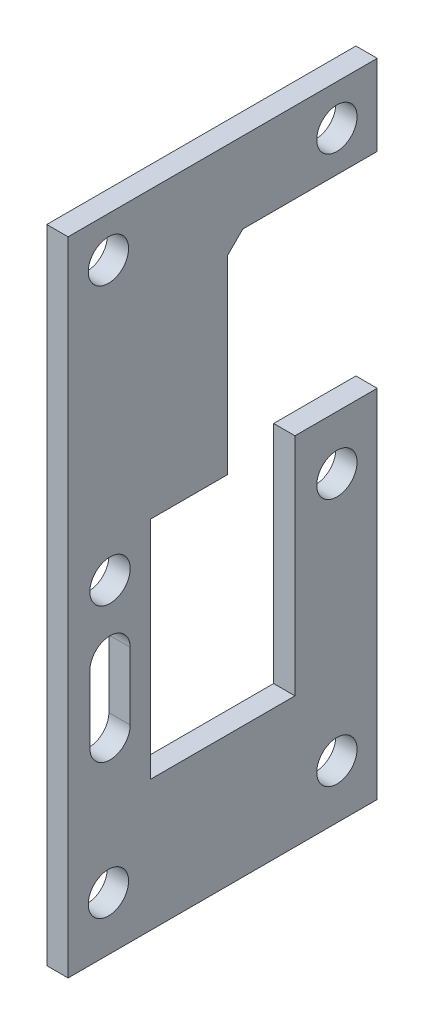
ISO-10303-21;
HEADER;
FILE_DESCRIPTION(('STEP AP214'),'2;1');
FILE_NAME('part.step','',(''),(''),'','','');
FILE_SCHEMA(('AUTOMOTIVE_DESIGN { 1 0 10303 214 1 1 1 1 }'));
ENDSEC;
DATA;
#1=APPLICATION_CONTEXT('core data for automotive mechanical design processes');
#2=APPLICATION_PROTOCOL_DEFINITION('international standard','automotive_design',2000,#1);
#3=PRODUCT_CONTEXT('',#1,'mechanical');
#4=PRODUCT('Part','Part','',(#3));
#5=PRODUCT_RELATED_PRODUCT_CATEGORY('part','',(#4));
#6=PRODUCT_DEFINITION_FORMATION('','',#4);
#7=PRODUCT_DEFINITION_CONTEXT('part definition',#1,'design');
#8=PRODUCT_DEFINITION('design','',#6,#7);
#9=PRODUCT_DEFINITION_SHAPE('','',#8);
#10=(LENGTH_UNIT() NAMED_UNIT(*) SI_UNIT(.MILLI.,.METRE.));
#11=(NAMED_UNIT(*) PLANE_ANGLE_UNIT() SI_UNIT($,.RADIAN.));
#12=(NAMED_UNIT(*) SI_UNIT($,.STERADIAN.) SOLID_ANGLE_UNIT());
#13=UNCERTAINTY_MEASURE_WITH_UNIT(LENGTH_MEASURE(1.E-05),#10,'distance_accuracy_value','');
#14=(GEOMETRIC_REPRESENTATION_CONTEXT(3) GLOBAL_UNCERTAINTY_ASSIGNED_CONTEXT((#13)) GLOBAL_UNIT_ASSIGNED_CONTEXT((#10,
#11,#12)) REPRESENTATION_CONTEXT('',''));
#15=CARTESIAN_POINT('',(0.,0.,0.));
#16=DIRECTION('',(0.,0.,1.));
#17=DIRECTION('',(1.,0.,0.));
#18=AXIS2_PLACEMENT_3D('',#15,#16,#17);
#19=CARTESIAN_POINT('',(3.175,47.76,-23.));
#20=DIRECTION('',(0.,0.,1.));
#21=DIRECTION('',(0.,-1.,0.));
#22=AXIS2_PLACEMENT_3D('',#19,#20,#21);
#23=PLANE('',#22);
#24=DIRECTION('',(0.,1.,0.));
#25=VECTOR('',#24,1.);
#26=CARTESIAN_POINT('',(3.175,47.76,-23.));
#27=LINE('',#26,#25);
#28=CARTESIAN_POINT('',(3.175,35.76,-23.));
#29=VERTEX_POINT('',#28);
#30=CARTESIAN_POINT('',(3.175,47.76,-23.));
#31=VERTEX_POINT('',#30);
#32=EDGE_CURVE('E296',#29,#31,#27,.T.);
#33=ORIENTED_EDGE('',*,*,#32,.F.);
#34=DIRECTION('',(1.,0.,0.));
#35=VECTOR('',#34,1.);
#36=CARTESIAN_POINT('',(0.,35.76,-23.));
#37=LINE('',#36,#35);
#38=CARTESIAN_POINT('',(0.,35.76,-23.));
#39=VERTEX_POINT('',#38);
#40=EDGE_CURVE('E286',#39,#29,#37,.T.);
#41=ORIENTED_EDGE('',*,*,#40,.F.);
#42=DIRECTION('',(0.,1.,0.));
#43=VECTOR('',#42,1.);
#44=CARTESIAN_POINT('',(0.,47.76,-23.));
#45=LINE('',#44,#43);
#46=CARTESIAN_POINT('',(0.,47.76,-23.));
#47=VERTEX_POINT('',#46);
#48=EDGE_CURVE('E307',#39,#47,#45,.T.);
#49=ORIENTED_EDGE('',*,*,#48,.T.);
#50=DIRECTION('',(-1.,0.,0.));
#51=VECTOR('',#50,1.);
#52=CARTESIAN_POINT('',(3.175,47.76,-23.));
#53=LINE('',#52,#51);
#54=EDGE_CURVE('E314',#31,#47,#53,.T.);
#55=ORIENTED_EDGE('',*,*,#54,.F.);
#56=EDGE_LOOP('',(#33,#41,#49,#55));
#57=FACE_BOUND('',#56,.T.);
#58=ADVANCED_FACE('F35',(#57),#23,.F.);
#59=CARTESIAN_POINT('',(3.175,47.76,23.));
#60=DIRECTION('',(0.,0.,-1.));
#61=DIRECTION('',(0.,1.,0.));
#62=AXIS2_PLACEMENT_3D('',#59,#60,#61);
#63=PLANE('',#62);
#64=DIRECTION('',(0.,-1.,0.));
#65=VECTOR('',#64,1.);
#66=CARTESIAN_POINT('',(0.,47.76,23.));
#67=LINE('',#66,#65);
#68=CARTESIAN_POINT('',(0.,47.76,23.));
#69=VERTEX_POINT('',#68);
#70=CARTESIAN_POINT('',(0.,-47.76,23.));
#71=VERTEX_POINT('',#70);
#72=EDGE_CURVE('E285',#69,#71,#67,.T.);
#73=ORIENTED_EDGE('',*,*,#72,.T.);
#74=DIRECTION('',(-1.,0.,0.));
#75=VECTOR('',#74,1.);
#76=CARTESIAN_POINT('',(3.175,-47.76,23.));
#77=LINE('',#76,#75);
#78=CARTESIAN_POINT('',(3.175,-47.76,23.));
#79=VERTEX_POINT('',#78);
#80=EDGE_CURVE('E11',#79,#71,#77,.T.);
#81=ORIENTED_EDGE('',*,*,#80,.F.);
#82=DIRECTION('',(0.,-1.,0.));
#83=VECTOR('',#82,1.);
#84=CARTESIAN_POINT('',(3.175,47.76,23.));
#85=LINE('',#84,#83);
#86=CARTESIAN_POINT('',(3.175,47.76,23.));
#87=VERTEX_POINT('',#86);
#88=EDGE_CURVE('E290',#87,#79,#85,.T.);
#89=ORIENTED_EDGE('',*,*,#88,.F.);
#90=DIRECTION('',(-1.,0.,0.));
#91=VECTOR('',#90,1.);
#92=CARTESIAN_POINT('',(3.175,47.76,23.));
#93=LINE('',#92,#91);
#94=EDGE_CURVE('E302',#87,#69,#93,.T.);
#95=ORIENTED_EDGE('',*,*,#94,.T.);
#96=EDGE_LOOP('',(#73,#81,#89,#95));
#97=FACE_BOUND('',#96,.T.);
#98=ADVANCED_FACE('F37',(#97),#63,.F.);
#99=CARTESIAN_POINT('',(3.175,-47.76,-23.));
#100=DIRECTION('',(0.,1.,0.));
#101=DIRECTION('',(0.,0.,1.));
#102=AXIS2_PLACEMENT_3D('',#99,#100,#101);
#103=PLANE('',#102);
#104=DIRECTION('',(0.,0.,-1.));
#105=VECTOR('',#104,1.);
#106=CARTESIAN_POINT('',(0.,-47.76,-23.));
#107=LINE('',#106,#105);
#108=CARTESIAN_POINT('',(0.,-47.76,-23.));
#109=VERTEX_POINT('',#108);
#110=EDGE_CURVE('E305',#71,#109,#107,.T.);
#111=ORIENTED_EDGE('',*,*,#110,.T.);
#112=DIRECTION('',(-1.,0.,0.));
#113=VECTOR('',#112,1.);
#114=CARTESIAN_POINT('',(3.175,-47.76,-23.));
#115=LINE('',#114,#113);
#116=CARTESIAN_POINT('',(3.175,-47.76,-23.));
#117=VERTEX_POINT('',#116);
#118=EDGE_CURVE('E43',#117,#109,#115,.T.);
#119=ORIENTED_EDGE('',*,*,#118,.F.);
#120=DIRECTION('',(0.,0.,-1.));
#121=VECTOR('',#120,1.);
#122=CARTESIAN_POINT('',(3.175,-47.76,-23.));
#123=LINE('',#122,#121);
#124=EDGE_CURVE('E293',#79,#117,#123,.T.);
#125=ORIENTED_EDGE('',*,*,#124,.F.);
#126=ORIENTED_EDGE('',*,*,#80,.T.);
#127=EDGE_LOOP('',(#111,#119,#125,#126));
#128=FACE_BOUND('',#127,.T.);
#129=ADVANCED_FACE('F335',(#128),#103,.F.);
#130=CARTESIAN_POINT('',(0.,5.24000000000001,-23.));
#131=VERTEX_POINT('',#130);
#132=EDGE_CURVE('E308',#109,#131,#45,.T.);
#133=ORIENTED_EDGE('',*,*,#132,.T.);
#134=DIRECTION('',(1.,0.,0.));
#135=VECTOR('',#134,1.);
#136=CARTESIAN_POINT('',(0.,5.23999999999999,-23.));
#137=LINE('',#136,#135);
#138=CARTESIAN_POINT('',(3.175,5.23999999999999,-23.));
#139=VERTEX_POINT('',#138);
#140=EDGE_CURVE('E279',#131,#139,#137,.T.);
#141=ORIENTED_EDGE('',*,*,#140,.T.);
#142=EDGE_CURVE('E297',#117,#139,#27,.T.);
#143=ORIENTED_EDGE('',*,*,#142,.F.);
#144=ORIENTED_EDGE('',*,*,#118,.T.);
#145=EDGE_LOOP('',(#133,#141,#143,#144));
#146=FACE_BOUND('',#145,.T.);
#147=ADVANCED_FACE('F321',(#146),#23,.F.);
#148=CARTESIAN_POINT('',(3.175,47.76,-23.));
#149=DIRECTION('',(0.,-1.,0.));
#150=DIRECTION('',(0.,0.,-1.));
#151=AXIS2_PLACEMENT_3D('',#148,#149,#150);
#152=PLANE('',#151);
#153=DIRECTION('',(0.,0.,1.));
#154=VECTOR('',#153,1.);
#155=CARTESIAN_POINT('',(0.,47.76,-23.));
#156=LINE('',#155,#154);
#157=EDGE_CURVE('E294',#47,#69,#156,.T.);
#158=ORIENTED_EDGE('',*,*,#157,.T.);
#159=ORIENTED_EDGE('',*,*,#94,.F.);
#160=DIRECTION('',(0.,0.,1.));
#161=VECTOR('',#160,1.);
#162=CARTESIAN_POINT('',(3.175,47.76,-23.));
#163=LINE('',#162,#161);
#164=EDGE_CURVE('E300',#31,#87,#163,.T.);
#165=ORIENTED_EDGE('',*,*,#164,.F.);
#166=ORIENTED_EDGE('',*,*,#54,.T.);
#167=EDGE_LOOP('',(#158,#159,#165,#166));
#168=FACE_BOUND('',#167,.T.);
#169=ADVANCED_FACE('F341',(#168),#152,.F.);
#170=CARTESIAN_POINT('',(3.175,0.,0.));
#171=DIRECTION('',(-1.,0.,0.));
#172=DIRECTION('',(0.,0.,1.));
#173=AXIS2_PLACEMENT_3D('',#170,#171,#172);
#174=PLANE('',#173);
#175=CARTESIAN_POINT('',(3.175,0.389999999999988,16.76));
#176=DIRECTION('',(1.,0.,0.));
#177=DIRECTION('',(0.,0.,-1.));
#178=AXIS2_PLACEMENT_3D('',#175,#176,#177);
#179=CIRCLE('',#178,3.);
#180=CARTESIAN_POINT('',(3.175,0.389999999999988,13.76));
#181=VERTEX_POINT('',#180);
#182=EDGE_CURVE('E178',#181,#181,#179,.T.);
#183=ORIENTED_EDGE('',*,*,#182,.F.);
#184=EDGE_LOOP('',(#183));
#185=FACE_BOUND('',#184,.T.);
#186=DIRECTION('',(0.,-1.,0.));
#187=VECTOR('',#186,1.);
#188=CARTESIAN_POINT('',(3.175,-9.77000000000002,19.76));
#189=LINE('',#188,#187);
#190=CARTESIAN_POINT('',(3.175,-9.77000000000002,19.76));
#191=VERTEX_POINT('',#190);
#192=CARTESIAN_POINT('',(3.175,-19.77,19.76));
#193=VERTEX_POINT('',#192);
#194=EDGE_CURVE('E184',#191,#193,#189,.T.);
#195=ORIENTED_EDGE('',*,*,#194,.F.);
#196=CARTESIAN_POINT('',(3.175,-9.77000000000001,16.76));
#197=DIRECTION('',(1.,0.,0.));
#198=DIRECTION('',(0.,0.,-1.));
#199=AXIS2_PLACEMENT_3D('',#196,#197,#198);
#200=CIRCLE('',#199,3.);
#201=CARTESIAN_POINT('',(3.175,-9.77000000000002,13.76));
#202=VERTEX_POINT('',#201);
#203=EDGE_CURVE('E50',#202,#191,#200,.T.);
#204=ORIENTED_EDGE('',*,*,#203,.F.);
#205=DIRECTION('',(0.,1.,0.));
#206=VECTOR('',#205,1.);
#207=CARTESIAN_POINT('',(3.175,-9.77000000000002,13.76));
#208=LINE('',#207,#206);
#209=CARTESIAN_POINT('',(3.175,-19.77,13.76));
#210=VERTEX_POINT('',#209);
#211=EDGE_CURVE('E172',#210,#202,#208,.T.);
#212=ORIENTED_EDGE('',*,*,#211,.F.);
#213=CARTESIAN_POINT('',(3.175,-19.77,16.76));
#214=DIRECTION('',(1.,0.,0.));
#215=DIRECTION('',(0.,0.,-1.));
#216=AXIS2_PLACEMENT_3D('',#213,#214,#215);
#217=CIRCLE('',#216,3.);
#218=EDGE_CURVE('E175',#193,#210,#217,.T.);
#219=ORIENTED_EDGE('',*,*,#218,.F.);
#220=EDGE_LOOP('',(#195,#204,#212,#219));
#221=FACE_BOUND('',#220,.T.);
#222=CARTESIAN_POINT('',(3.175,41.76,-17.));
#223=DIRECTION('',(1.,0.,0.));
#224=DIRECTION('',(0.,0.,-1.));
#225=AXIS2_PLACEMENT_3D('',#222,#223,#224);
#226=CIRCLE('',#225,3.);
#227=CARTESIAN_POINT('',(3.175,41.76,-20.));
#228=VERTEX_POINT('',#227);
#229=EDGE_CURVE('E241',#228,#228,#226,.T.);
#230=ORIENTED_EDGE('',*,*,#229,.F.);
#231=EDGE_LOOP('',(#230));
#232=FACE_BOUND('',#231,.T.);
#233=CARTESIAN_POINT('',(3.175,41.76,17.));
#234=DIRECTION('',(1.,0.,0.));
#235=DIRECTION('',(0.,0.,-1.));
#236=AXIS2_PLACEMENT_3D('',#233,#234,#235);
#237=CIRCLE('',#236,3.);
#238=CARTESIAN_POINT('',(3.175,41.76,14.));
#239=VERTEX_POINT('',#238);
#240=EDGE_CURVE('E248',#239,#239,#237,.T.);
#241=ORIENTED_EDGE('',*,*,#240,.F.);
#242=EDGE_LOOP('',(#241));
#243=FACE_BOUND('',#242,.T.);
#244=CARTESIAN_POINT('',(3.175,-39.76,17.));
#245=DIRECTION('',(1.,0.,0.));
#246=DIRECTION('',(0.,0.,-1.));
#247=AXIS2_PLACEMENT_3D('',#244,#245,#246);
#248=CIRCLE('',#247,3.);
#249=CARTESIAN_POINT('',(3.175,-39.76,14.));
#250=VERTEX_POINT('',#249);
#251=EDGE_CURVE('E254',#250,#250,#248,.T.);
#252=ORIENTED_EDGE('',*,*,#251,.F.);
#253=EDGE_LOOP('',(#252));
#254=FACE_BOUND('',#253,.T.);
#255=CARTESIAN_POINT('',(3.175,-2.76000000000001,-17.));
#256=DIRECTION('',(1.,0.,0.));
#257=DIRECTION('',(0.,0.,-1.));
#258=AXIS2_PLACEMENT_3D('',#255,#256,#257);
#259=CIRCLE('',#258,3.);
#260=CARTESIAN_POINT('',(3.175,-2.76000000000001,-20.));
#261=VERTEX_POINT('',#260);
#262=EDGE_CURVE('E260',#261,#261,#259,.T.);
#263=ORIENTED_EDGE('',*,*,#262,.F.);
#264=EDGE_LOOP('',(#263));
#265=FACE_BOUND('',#264,.T.);
#266=CARTESIAN_POINT('',(3.175,-39.76,-17.));
#267=DIRECTION('',(1.,0.,0.));
#268=DIRECTION('',(0.,0.,-1.));
#269=AXIS2_PLACEMENT_3D('',#266,#267,#268);
#270=CIRCLE('',#269,3.);
#271=CARTESIAN_POINT('',(3.175,-39.76,-20.));
#272=VERTEX_POINT('',#271);
#273=EDGE_CURVE('E266',#272,#272,#270,.T.);
#274=ORIENTED_EDGE('',*,*,#273,.F.);
#275=EDGE_LOOP('',(#274));
#276=FACE_BOUND('',#275,.T.);
#277=DIRECTION('',(0.,0.,-1.));
#278=VECTOR('',#277,1.);
#279=CARTESIAN_POINT('',(3.175,-28.28,10.76));
#280=LINE('',#279,#278);
#281=CARTESIAN_POINT('',(3.175,-28.28,10.76));
#282=VERTEX_POINT('',#281);
#283=CARTESIAN_POINT('',(3.175,-28.28,-10.76));
#284=VERTEX_POINT('',#283);
#285=EDGE_CURVE('E197',#282,#284,#280,.T.);
#286=ORIENTED_EDGE('',*,*,#285,.F.);
#287=DIRECTION('',(0.,-1.,0.));
#288=VECTOR('',#287,1.);
#289=CARTESIAN_POINT('',(3.175,5.23999999999999,10.76));
#290=LINE('',#289,#288);
#291=CARTESIAN_POINT('',(3.175,5.23999999999999,10.76));
#292=VERTEX_POINT('',#291);
#293=EDGE_CURVE('E204',#292,#282,#290,.T.);
#294=ORIENTED_EDGE('',*,*,#293,.F.);
#295=DIRECTION('',(0.,0.,1.));
#296=VECTOR('',#295,1.);
#297=CARTESIAN_POINT('',(3.175,5.23999999999999,-10.76));
#298=LINE('',#297,#296);
#299=CARTESIAN_POINT('',(3.175,5.23999999999999,-0.70190296114374));
#300=VERTEX_POINT('',#299);
#301=EDGE_CURVE('E210',#300,#292,#298,.T.);
#302=ORIENTED_EDGE('',*,*,#301,.F.);
#303=DIRECTION('',(0.,-1.,0.));
#304=VECTOR('',#303,1.);
#305=CARTESIAN_POINT('',(3.175,33.4619029611437,-0.701902961143737));
#306=LINE('',#305,#304);
#307=CARTESIAN_POINT('',(3.175,33.4619029611437,-0.701902961143737));
#308=VERTEX_POINT('',#307);
#309=EDGE_CURVE('E231',#308,#300,#306,.T.);
#310=ORIENTED_EDGE('',*,*,#309,.F.);
#311=DIRECTION('',(0.,-0.70710678118655,0.707106781186545));
#312=VECTOR('',#311,1.);
#313=CARTESIAN_POINT('',(3.175,35.76,-3.00000000000001));
#314=LINE('',#313,#312);
#315=CARTESIAN_POINT('',(3.175,35.76,-3.00000000000001));
#316=VERTEX_POINT('',#315);
#317=EDGE_CURVE('E224',#316,#308,#314,.T.);
#318=ORIENTED_EDGE('',*,*,#317,.F.);
#319=DIRECTION('',(0.,0.,1.));
#320=VECTOR('',#319,1.);
#321=CARTESIAN_POINT('',(3.175,35.76,-23.));
#322=LINE('',#321,#320);
#323=EDGE_CURVE('E276',#29,#316,#322,.T.);
#324=ORIENTED_EDGE('',*,*,#323,.F.);
#325=ORIENTED_EDGE('',*,*,#32,.T.);
#326=ORIENTED_EDGE('',*,*,#164,.T.);
#327=ORIENTED_EDGE('',*,*,#88,.T.);
#328=ORIENTED_EDGE('',*,*,#124,.T.);
#329=ORIENTED_EDGE('',*,*,#142,.T.);
#330=DIRECTION('',(0.,0.,-1.));
#331=VECTOR('',#330,1.);
#332=CARTESIAN_POINT('',(3.175,5.23999999999999,-23.));
#333=LINE('',#332,#331);
#334=CARTESIAN_POINT('',(3.175,5.23999999999999,-10.76));
#335=VERTEX_POINT('',#334);
#336=EDGE_CURVE('E272',#335,#139,#333,.T.);
#337=ORIENTED_EDGE('',*,*,#336,.F.);
#338=DIRECTION('',(0.,1.,0.));
#339=VECTOR('',#338,1.);
#340=CARTESIAN_POINT('',(3.175,5.23999999999999,-10.76));
#341=LINE('',#340,#339);
#342=EDGE_CURVE('E218',#284,#335,#341,.T.);
#343=ORIENTED_EDGE('',*,*,#342,.F.);
#344=EDGE_LOOP('',(#286,#294,#302,#310,#318,#324,#325,#326,#327,#328,#329,#337,#343));
#345=FACE_BOUND('',#344,.T.);
#346=ADVANCED_FACE('F332',(#185,#221,#232,#243,#254,#265,#276,#345),#174,.F.);
#347=CARTESIAN_POINT('',(0.,0.,0.));
#348=DIRECTION('',(-1.,0.,0.));
#349=DIRECTION('',(0.,0.,1.));
#350=AXIS2_PLACEMENT_3D('',#347,#348,#349);
#351=PLANE('',#350);
#352=CARTESIAN_POINT('',(0.,0.389999999999988,16.76));
#353=DIRECTION('',(1.,0.,0.));
#354=DIRECTION('',(0.,0.,-1.));
#355=AXIS2_PLACEMENT_3D('',#352,#353,#354);
#356=CIRCLE('',#355,3.);
#357=CARTESIAN_POINT('',(0.,0.389999999999988,13.76));
#358=VERTEX_POINT('',#357);
#359=EDGE_CURVE('E200',#358,#358,#356,.T.);
#360=ORIENTED_EDGE('',*,*,#359,.T.);
#361=EDGE_LOOP('',(#360));
#362=FACE_BOUND('',#361,.T.);
#363=CARTESIAN_POINT('',(0.,-9.77000000000001,16.76));
#364=DIRECTION('',(1.,0.,0.));
#365=DIRECTION('',(0.,0.,-1.));
#366=AXIS2_PLACEMENT_3D('',#363,#364,#365);
#367=CIRCLE('',#366,3.);
#368=CARTESIAN_POINT('',(0.,-9.77000000000002,13.76));
#369=VERTEX_POINT('',#368);
#370=CARTESIAN_POINT('',(0.,-9.77000000000002,19.76));
#371=VERTEX_POINT('',#370);
#372=EDGE_CURVE('E156',#369,#371,#367,.T.);
#373=ORIENTED_EDGE('',*,*,#372,.T.);
#374=DIRECTION('',(0.,-1.,0.));
#375=VECTOR('',#374,1.);
#376=CARTESIAN_POINT('',(0.,-9.77000000000002,19.76));
#377=LINE('',#376,#375);
#378=CARTESIAN_POINT('',(0.,-19.77,19.76));
#379=VERTEX_POINT('',#378);
#380=EDGE_CURVE('E165',#371,#379,#377,.T.);
#381=ORIENTED_EDGE('',*,*,#380,.T.);
#382=CARTESIAN_POINT('',(0.,-19.77,16.76));
#383=DIRECTION('',(1.,0.,0.));
#384=DIRECTION('',(0.,0.,-1.));
#385=AXIS2_PLACEMENT_3D('',#382,#383,#384);
#386=CIRCLE('',#385,3.);
#387=CARTESIAN_POINT('',(0.,-19.77,13.76));
#388=VERTEX_POINT('',#387);
#389=EDGE_CURVE('E58',#379,#388,#386,.T.);
#390=ORIENTED_EDGE('',*,*,#389,.T.);
#391=DIRECTION('',(0.,1.,0.));
#392=VECTOR('',#391,1.);
#393=CARTESIAN_POINT('',(0.,-9.77000000000002,13.76));
#394=LINE('',#393,#392);
#395=EDGE_CURVE('E162',#388,#369,#394,.T.);
#396=ORIENTED_EDGE('',*,*,#395,.T.);
#397=EDGE_LOOP('',(#373,#381,#390,#396));
#398=FACE_BOUND('',#397,.T.);
#399=DIRECTION('',(0.,-1.,0.));
#400=VECTOR('',#399,1.);
#401=CARTESIAN_POINT('',(0.,5.23999999999999,10.76));
#402=LINE('',#401,#400);
#403=CARTESIAN_POINT('',(0.,5.23999999999999,10.76));
#404=VERTEX_POINT('',#403);
#405=CARTESIAN_POINT('',(0.,-28.28,10.76));
#406=VERTEX_POINT('',#405);
#407=EDGE_CURVE('E207',#404,#406,#402,.T.);
#408=ORIENTED_EDGE('',*,*,#407,.T.);
#409=DIRECTION('',(0.,0.,-1.));
#410=VECTOR('',#409,1.);
#411=CARTESIAN_POINT('',(0.,-28.28,10.76));
#412=LINE('',#411,#410);
#413=CARTESIAN_POINT('',(0.,-28.28,-10.76));
#414=VERTEX_POINT('',#413);
#415=EDGE_CURVE('E193',#406,#414,#412,.T.);
#416=ORIENTED_EDGE('',*,*,#415,.T.);
#417=DIRECTION('',(0.,1.,0.));
#418=VECTOR('',#417,1.);
#419=CARTESIAN_POINT('',(0.,5.23999999999999,-10.76));
#420=LINE('',#419,#418);
#421=CARTESIAN_POINT('',(0.,5.23999999999999,-10.76));
#422=VERTEX_POINT('',#421);
#423=EDGE_CURVE('E209',#414,#422,#420,.T.);
#424=ORIENTED_EDGE('',*,*,#423,.T.);
#425=DIRECTION('',(0.,0.,-1.));
#426=VECTOR('',#425,1.);
#427=CARTESIAN_POINT('',(0.,5.23999999999999,-23.));
#428=LINE('',#427,#426);
#429=EDGE_CURVE('E273',#422,#131,#428,.T.);
#430=ORIENTED_EDGE('',*,*,#429,.T.);
#431=ORIENTED_EDGE('',*,*,#132,.F.);
#432=ORIENTED_EDGE('',*,*,#110,.F.);
#433=ORIENTED_EDGE('',*,*,#72,.F.);
#434=ORIENTED_EDGE('',*,*,#157,.F.);
#435=ORIENTED_EDGE('',*,*,#48,.F.);
#436=DIRECTION('',(0.,0.,1.));
#437=VECTOR('',#436,1.);
#438=CARTESIAN_POINT('',(0.,35.76,-23.));
#439=LINE('',#438,#437);
#440=CARTESIAN_POINT('',(0.,35.76,-3.00000000000001));
#441=VERTEX_POINT('',#440);
#442=EDGE_CURVE('E275',#39,#441,#439,.T.);
#443=ORIENTED_EDGE('',*,*,#442,.T.);
#444=DIRECTION('',(0.,-0.70710678118655,0.707106781186545));
#445=VECTOR('',#444,1.);
#446=CARTESIAN_POINT('',(0.,35.76,-3.00000000000001));
#447=LINE('',#446,#445);
#448=CARTESIAN_POINT('',(0.,33.4619029611437,-0.701902961143737));
#449=VERTEX_POINT('',#448);
#450=EDGE_CURVE('E227',#441,#449,#447,.T.);
#451=ORIENTED_EDGE('',*,*,#450,.T.);
#452=DIRECTION('',(0.,-1.,0.));
#453=VECTOR('',#452,1.);
#454=CARTESIAN_POINT('',(0.,33.4619029611437,-0.701902961143737));
#455=LINE('',#454,#453);
#456=CARTESIAN_POINT('',(0.,5.24,-0.701902961143741));
#457=VERTEX_POINT('',#456);
#458=EDGE_CURVE('E230',#449,#457,#455,.T.);
#459=ORIENTED_EDGE('',*,*,#458,.T.);
#460=DIRECTION('',(0.,0.,1.));
#461=VECTOR('',#460,1.);
#462=CARTESIAN_POINT('',(0.,5.23999999999999,-10.76));
#463=LINE('',#462,#461);
#464=EDGE_CURVE('E213',#457,#404,#463,.T.);
#465=ORIENTED_EDGE('',*,*,#464,.T.);
#466=EDGE_LOOP('',(#408,#416,#424,#430,#431,#432,#433,#434,#435,#443,#451,#459,#465));
#467=FACE_BOUND('',#466,.T.);
#468=CARTESIAN_POINT('',(0.,41.76,-17.));
#469=DIRECTION('',(1.,0.,0.));
#470=DIRECTION('',(0.,0.,-1.));
#471=AXIS2_PLACEMENT_3D('',#468,#469,#470);
#472=CIRCLE('',#471,3.);
#473=CARTESIAN_POINT('',(0.,41.76,-20.));
#474=VERTEX_POINT('',#473);
#475=EDGE_CURVE('E245',#474,#474,#472,.T.);
#476=ORIENTED_EDGE('',*,*,#475,.T.);
#477=EDGE_LOOP('',(#476));
#478=FACE_BOUND('',#477,.T.);
#479=CARTESIAN_POINT('',(0.,41.76,17.));
#480=DIRECTION('',(1.,0.,0.));
#481=DIRECTION('',(0.,0.,-1.));
#482=AXIS2_PLACEMENT_3D('',#479,#480,#481);
#483=CIRCLE('',#482,3.);
#484=CARTESIAN_POINT('',(0.,41.76,14.));
#485=VERTEX_POINT('',#484);
#486=EDGE_CURVE('E251',#485,#485,#483,.T.);
#487=ORIENTED_EDGE('',*,*,#486,.T.);
#488=EDGE_LOOP('',(#487));
#489=FACE_BOUND('',#488,.T.);
#490=CARTESIAN_POINT('',(0.,-39.76,17.));
#491=DIRECTION('',(1.,0.,0.));
#492=DIRECTION('',(0.,0.,-1.));
#493=AXIS2_PLACEMENT_3D('',#490,#491,#492);
#494=CIRCLE('',#493,3.);
#495=CARTESIAN_POINT('',(0.,-39.76,14.));
#496=VERTEX_POINT('',#495);
#497=EDGE_CURVE('E257',#496,#496,#494,.T.);
#498=ORIENTED_EDGE('',*,*,#497,.T.);
#499=EDGE_LOOP('',(#498));
#500=FACE_BOUND('',#499,.T.);
#501=CARTESIAN_POINT('',(0.,-2.76000000000001,-17.));
#502=DIRECTION('',(1.,0.,0.));
#503=DIRECTION('',(0.,0.,-1.));
#504=AXIS2_PLACEMENT_3D('',#501,#502,#503);
#505=CIRCLE('',#504,3.);
#506=CARTESIAN_POINT('',(0.,-2.76000000000001,-20.));
#507=VERTEX_POINT('',#506);
#508=EDGE_CURVE('E263',#507,#507,#505,.T.);
#509=ORIENTED_EDGE('',*,*,#508,.T.);
#510=EDGE_LOOP('',(#509));
#511=FACE_BOUND('',#510,.T.);
#512=CARTESIAN_POINT('',(0.,-39.76,-17.));
#513=DIRECTION('',(1.,0.,0.));
#514=DIRECTION('',(0.,0.,-1.));
#515=AXIS2_PLACEMENT_3D('',#512,#513,#514);
#516=CIRCLE('',#515,3.);
#517=CARTESIAN_POINT('',(0.,-39.76,-20.));
#518=VERTEX_POINT('',#517);
#519=EDGE_CURVE('E269',#518,#518,#516,.T.);
#520=ORIENTED_EDGE('',*,*,#519,.T.);
#521=EDGE_LOOP('',(#520));
#522=FACE_BOUND('',#521,.T.);
#523=ADVANCED_FACE('F169',(#362,#398,#467,#478,#489,#500,#511,#522),#351,.T.);
#524=CARTESIAN_POINT('',(0.,35.76,-23.));
#525=DIRECTION('',(0.,1.,0.));
#526=DIRECTION('',(0.,0.,1.));
#527=AXIS2_PLACEMENT_3D('',#524,#525,#526);
#528=PLANE('',#527);
#529=ORIENTED_EDGE('',*,*,#323,.T.);
#530=DIRECTION('',(1.,0.,0.));
#531=VECTOR('',#530,1.);
#532=CARTESIAN_POINT('',(0.,35.76,-3.00000000000001));
#533=LINE('',#532,#531);
#534=EDGE_CURVE('E283',#441,#316,#533,.T.);
#535=ORIENTED_EDGE('',*,*,#534,.F.);
#536=ORIENTED_EDGE('',*,*,#442,.F.);
#537=ORIENTED_EDGE('',*,*,#40,.T.);
#538=EDGE_LOOP('',(#529,#535,#536,#537));
#539=FACE_BOUND('',#538,.T.);
#540=ADVANCED_FACE('F349',(#539),#528,.F.);
#541=CARTESIAN_POINT('',(0.,5.23999999999999,-23.));
#542=DIRECTION('',(0.,-1.,0.));
#543=DIRECTION('',(0.,0.,-1.));
#544=AXIS2_PLACEMENT_3D('',#541,#542,#543);
#545=PLANE('',#544);
#546=ORIENTED_EDGE('',*,*,#429,.F.);
#547=DIRECTION('',(1.,0.,0.));
#548=VECTOR('',#547,1.);
#549=CARTESIAN_POINT('',(0.,5.23999999999999,-10.76));
#550=LINE('',#549,#548);
#551=EDGE_CURVE('E216',#422,#335,#550,.T.);
#552=ORIENTED_EDGE('',*,*,#551,.T.);
#553=ORIENTED_EDGE('',*,*,#336,.T.);
#554=ORIENTED_EDGE('',*,*,#140,.F.);
#555=EDGE_LOOP('',(#546,#552,#553,#554));
#556=FACE_BOUND('',#555,.T.);
#557=ADVANCED_FACE('F328',(#556),#545,.F.);
#558=CARTESIAN_POINT('',(3.175,-39.76,-17.));
#559=DIRECTION('',(1.,0.,0.));
#560=DIRECTION('',(0.,0.,-1.));
#561=AXIS2_PLACEMENT_3D('',#558,#559,#560);
#562=CYLINDRICAL_SURFACE('',#561,3.);
#563=ORIENTED_EDGE('',*,*,#519,.F.);
#564=EDGE_LOOP('',(#563));
#565=FACE_BOUND('',#564,.T.);
#566=ORIENTED_EDGE('',*,*,#273,.T.);
#567=EDGE_LOOP('',(#566));
#568=FACE_BOUND('',#567,.T.);
#569=ADVANCED_FACE('F452',(#565,#568),#562,.F.);
#570=CARTESIAN_POINT('',(3.175,-2.76000000000001,-17.));
#571=DIRECTION('',(1.,0.,0.));
#572=DIRECTION('',(0.,0.,-1.));
#573=AXIS2_PLACEMENT_3D('',#570,#571,#572);
#574=CYLINDRICAL_SURFACE('',#573,3.);
#575=ORIENTED_EDGE('',*,*,#508,.F.);
#576=EDGE_LOOP('',(#575));
#577=FACE_BOUND('',#576,.T.);
#578=ORIENTED_EDGE('',*,*,#262,.T.);
#579=EDGE_LOOP('',(#578));
#580=FACE_BOUND('',#579,.T.);
#581=ADVANCED_FACE('F463',(#577,#580),#574,.F.);
#582=CARTESIAN_POINT('',(3.175,-39.76,17.));
#583=DIRECTION('',(1.,0.,0.));
#584=DIRECTION('',(0.,0.,-1.));
#585=AXIS2_PLACEMENT_3D('',#582,#583,#584);
#586=CYLINDRICAL_SURFACE('',#585,3.);
#587=ORIENTED_EDGE('',*,*,#497,.F.);
#588=EDGE_LOOP('',(#587));
#589=FACE_BOUND('',#588,.T.);
#590=ORIENTED_EDGE('',*,*,#251,.T.);
#591=EDGE_LOOP('',(#590));
#592=FACE_BOUND('',#591,.T.);
#593=ADVANCED_FACE('F472',(#589,#592),#586,.F.);
#594=CARTESIAN_POINT('',(3.175,41.76,17.));
#595=DIRECTION('',(1.,0.,0.));
#596=DIRECTION('',(0.,0.,-1.));
#597=AXIS2_PLACEMENT_3D('',#594,#595,#596);
#598=CYLINDRICAL_SURFACE('',#597,3.);
#599=ORIENTED_EDGE('',*,*,#486,.F.);
#600=EDGE_LOOP('',(#599));
#601=FACE_BOUND('',#600,.T.);
#602=ORIENTED_EDGE('',*,*,#240,.T.);
#603=EDGE_LOOP('',(#602));
#604=FACE_BOUND('',#603,.T.);
#605=ADVANCED_FACE('F481',(#601,#604),#598,.F.);
#606=CARTESIAN_POINT('',(3.175,41.76,-17.));
#607=DIRECTION('',(1.,0.,0.));
#608=DIRECTION('',(0.,0.,-1.));
#609=AXIS2_PLACEMENT_3D('',#606,#607,#608);
#610=CYLINDRICAL_SURFACE('',#609,3.);
#611=ORIENTED_EDGE('',*,*,#475,.F.);
#612=EDGE_LOOP('',(#611));
#613=FACE_BOUND('',#612,.T.);
#614=ORIENTED_EDGE('',*,*,#229,.T.);
#615=EDGE_LOOP('',(#614));
#616=FACE_BOUND('',#615,.T.);
#617=ADVANCED_FACE('F489',(#613,#616),#610,.F.);
#618=CARTESIAN_POINT('',(0.,33.4619029611437,-0.701902961143737));
#619=DIRECTION('',(0.,0.,1.));
#620=DIRECTION('',(0.,-1.,0.));
#621=AXIS2_PLACEMENT_3D('',#618,#619,#620);
#622=PLANE('',#621);
#623=ORIENTED_EDGE('',*,*,#309,.T.);
#624=DIRECTION('',(1.,0.,0.));
#625=VECTOR('',#624,1.);
#626=CARTESIAN_POINT('',(0.,5.24,-0.701902961143741));
#627=LINE('',#626,#625);
#628=EDGE_CURVE('E239',#457,#300,#627,.T.);
#629=ORIENTED_EDGE('',*,*,#628,.F.);
#630=ORIENTED_EDGE('',*,*,#458,.F.);
#631=DIRECTION('',(1.,0.,0.));
#632=VECTOR('',#631,1.);
#633=CARTESIAN_POINT('',(0.,33.4619029611437,-0.701902961143737));
#634=LINE('',#633,#632);
#635=EDGE_CURVE('E234',#449,#308,#634,.T.);
#636=ORIENTED_EDGE('',*,*,#635,.T.);
#637=EDGE_LOOP('',(#623,#629,#630,#636));
#638=FACE_BOUND('',#637,.T.);
#639=ADVANCED_FACE('F359',(#638),#622,.F.);
#640=CARTESIAN_POINT('',(0.,35.76,-3.00000000000001));
#641=DIRECTION('',(0.,0.707106781186545,0.707106781186549));
#642=DIRECTION('',(0.,-0.70710678118655,0.707106781186545));
#643=AXIS2_PLACEMENT_3D('',#640,#641,#642);
#644=PLANE('',#643);
#645=ORIENTED_EDGE('',*,*,#317,.T.);
#646=ORIENTED_EDGE('',*,*,#635,.F.);
#647=ORIENTED_EDGE('',*,*,#450,.F.);
#648=ORIENTED_EDGE('',*,*,#534,.T.);
#649=EDGE_LOOP('',(#645,#646,#647,#648));
#650=FACE_BOUND('',#649,.T.);
#651=ADVANCED_FACE('F355',(#650),#644,.F.);
#652=CARTESIAN_POINT('',(0.,5.23999999999999,-10.76));
#653=DIRECTION('',(0.,1.,0.));
#654=DIRECTION('',(0.,0.,1.));
#655=AXIS2_PLACEMENT_3D('',#652,#653,#654);
#656=PLANE('',#655);
#657=ORIENTED_EDGE('',*,*,#301,.T.);
#658=DIRECTION('',(1.,0.,0.));
#659=VECTOR('',#658,1.);
#660=CARTESIAN_POINT('',(0.,5.23999999999999,10.76));
#661=LINE('',#660,#659);
#662=EDGE_CURVE('E221',#404,#292,#661,.T.);
#663=ORIENTED_EDGE('',*,*,#662,.F.);
#664=ORIENTED_EDGE('',*,*,#464,.F.);
#665=ORIENTED_EDGE('',*,*,#628,.T.);
#666=EDGE_LOOP('',(#657,#663,#664,#665));
#667=FACE_BOUND('',#666,.T.);
#668=ADVANCED_FACE('F361',(#667),#656,.F.);
#669=CARTESIAN_POINT('',(0.,5.23999999999999,10.76));
#670=DIRECTION('',(0.,0.,1.));
#671=DIRECTION('',(0.,-1.,0.));
#672=AXIS2_PLACEMENT_3D('',#669,#670,#671);
#673=PLANE('',#672);
#674=ORIENTED_EDGE('',*,*,#293,.T.);
#675=DIRECTION('',(1.,0.,0.));
#676=VECTOR('',#675,1.);
#677=CARTESIAN_POINT('',(0.,-28.28,10.76));
#678=LINE('',#677,#676);
#679=EDGE_CURVE('E196',#406,#282,#678,.T.);
#680=ORIENTED_EDGE('',*,*,#679,.F.);
#681=ORIENTED_EDGE('',*,*,#407,.F.);
#682=ORIENTED_EDGE('',*,*,#662,.T.);
#683=EDGE_LOOP('',(#674,#680,#681,#682));
#684=FACE_BOUND('',#683,.T.);
#685=ADVANCED_FACE('F365',(#684),#673,.F.);
#686=CARTESIAN_POINT('',(0.,5.23999999999999,-10.76));
#687=DIRECTION('',(0.,0.,-1.));
#688=DIRECTION('',(0.,1.,0.));
#689=AXIS2_PLACEMENT_3D('',#686,#687,#688);
#690=PLANE('',#689);
#691=ORIENTED_EDGE('',*,*,#342,.T.);
#692=ORIENTED_EDGE('',*,*,#551,.F.);
#693=ORIENTED_EDGE('',*,*,#423,.F.);
#694=DIRECTION('',(1.,0.,0.));
#695=VECTOR('',#694,1.);
#696=CARTESIAN_POINT('',(0.,-28.28,-10.76));
#697=LINE('',#696,#695);
#698=EDGE_CURVE('E201',#414,#284,#697,.T.);
#699=ORIENTED_EDGE('',*,*,#698,.T.);
#700=EDGE_LOOP('',(#691,#692,#693,#699));
#701=FACE_BOUND('',#700,.T.);
#702=ADVANCED_FACE('F372',(#701),#690,.F.);
#703=CARTESIAN_POINT('',(0.,-28.28,10.76));
#704=DIRECTION('',(0.,-1.,0.));
#705=DIRECTION('',(0.,0.,-1.));
#706=AXIS2_PLACEMENT_3D('',#703,#704,#705);
#707=PLANE('',#706);
#708=ORIENTED_EDGE('',*,*,#285,.T.);
#709=ORIENTED_EDGE('',*,*,#698,.F.);
#710=ORIENTED_EDGE('',*,*,#415,.F.);
#711=ORIENTED_EDGE('',*,*,#679,.T.);
#712=EDGE_LOOP('',(#708,#709,#710,#711));
#713=FACE_BOUND('',#712,.T.);
#714=ADVANCED_FACE('F369',(#713),#707,.F.);
#715=CARTESIAN_POINT('',(0.,-9.77000000000001,16.76));
#716=DIRECTION('',(1.,0.,0.));
#717=DIRECTION('',(0.,0.,-1.));
#718=AXIS2_PLACEMENT_3D('',#715,#716,#717);
#719=CYLINDRICAL_SURFACE('',#718,3.);
#720=ORIENTED_EDGE('',*,*,#203,.T.);
#721=DIRECTION('',(1.,0.,0.));
#722=VECTOR('',#721,1.);
#723=CARTESIAN_POINT('',(0.,-9.77000000000002,19.76));
#724=LINE('',#723,#722);
#725=EDGE_CURVE('E152',#371,#191,#724,.T.);
#726=ORIENTED_EDGE('',*,*,#725,.F.);
#727=ORIENTED_EDGE('',*,*,#372,.F.);
#728=DIRECTION('',(1.,0.,0.));
#729=VECTOR('',#728,1.);
#730=CARTESIAN_POINT('',(0.,-9.77000000000002,13.76));
#731=LINE('',#730,#729);
#732=EDGE_CURVE('E188',#369,#202,#731,.T.);
#733=ORIENTED_EDGE('',*,*,#732,.T.);
#734=EDGE_LOOP('',(#720,#726,#727,#733));
#735=FACE_BOUND('',#734,.T.);
#736=ADVANCED_FACE('F154',(#735),#719,.F.);
#737=CARTESIAN_POINT('',(0.,-9.77000000000002,13.76));
#738=DIRECTION('',(0.,0.,-1.));
#739=DIRECTION('',(0.,1.,0.));
#740=AXIS2_PLACEMENT_3D('',#737,#738,#739);
#741=PLANE('',#740);
#742=ORIENTED_EDGE('',*,*,#211,.T.);
#743=ORIENTED_EDGE('',*,*,#732,.F.);
#744=ORIENTED_EDGE('',*,*,#395,.F.);
#745=DIRECTION('',(1.,0.,0.));
#746=VECTOR('',#745,1.);
#747=CARTESIAN_POINT('',(0.,-19.77,13.76));
#748=LINE('',#747,#746);
#749=EDGE_CURVE('E190',#388,#210,#748,.T.);
#750=ORIENTED_EDGE('',*,*,#749,.T.);
#751=EDGE_LOOP('',(#742,#743,#744,#750));
#752=FACE_BOUND('',#751,.T.);
#753=ADVANCED_FACE('F537',(#752),#741,.F.);
#754=CARTESIAN_POINT('',(0.,-19.77,16.76));
#755=DIRECTION('',(1.,0.,0.));
#756=DIRECTION('',(0.,0.,-1.));
#757=AXIS2_PLACEMENT_3D('',#754,#755,#756);
#758=CYLINDRICAL_SURFACE('',#757,3.);
#759=ORIENTED_EDGE('',*,*,#218,.T.);
#760=ORIENTED_EDGE('',*,*,#749,.F.);
#761=ORIENTED_EDGE('',*,*,#389,.F.);
#762=DIRECTION('',(1.,0.,0.));
#763=VECTOR('',#762,1.);
#764=CARTESIAN_POINT('',(0.,-19.77,19.76));
#765=LINE('',#764,#763);
#766=EDGE_CURVE('E161',#379,#193,#765,.T.);
#767=ORIENTED_EDGE('',*,*,#766,.T.);
#768=EDGE_LOOP('',(#759,#760,#761,#767));
#769=FACE_BOUND('',#768,.T.);
#770=ADVANCED_FACE('F543',(#769),#758,.F.);
#771=CARTESIAN_POINT('',(0.,-9.77000000000002,19.76));
#772=DIRECTION('',(0.,0.,1.));
#773=DIRECTION('',(1.,0.,0.));
#774=AXIS2_PLACEMENT_3D('',#771,#772,#773);
#775=PLANE('',#774);
#776=ORIENTED_EDGE('',*,*,#194,.T.);
#777=ORIENTED_EDGE('',*,*,#766,.F.);
#778=ORIENTED_EDGE('',*,*,#380,.F.);
#779=ORIENTED_EDGE('',*,*,#725,.T.);
#780=EDGE_LOOP('',(#776,#777,#778,#779));
#781=FACE_BOUND('',#780,.T.);
#782=ADVANCED_FACE('F166',(#781),#775,.F.);
#783=CARTESIAN_POINT('',(0.,0.389999999999988,16.76));
#784=DIRECTION('',(1.,0.,0.));
#785=DIRECTION('',(0.,0.,-1.));
#786=AXIS2_PLACEMENT_3D('',#783,#784,#785);
#787=CYLINDRICAL_SURFACE('',#786,3.);
#788=ORIENTED_EDGE('',*,*,#359,.F.);
#789=EDGE_LOOP('',(#788));
#790=FACE_BOUND('',#789,.T.);
#791=ORIENTED_EDGE('',*,*,#182,.T.);
#792=EDGE_LOOP('',(#791));
#793=FACE_BOUND('',#792,.T.);
#794=ADVANCED_FACE('F557',(#790,#793),#787,.F.);
#795=CLOSED_SHELL('',(#58,#98,#129,#147,#169,#346,#523,#540,#557,#569,#581,#593,#605,#617,#639,
#651,#668,#685,#702,#714,#736,#753,#770,#782,#794));
#796=MANIFOLD_SOLID_BREP('B2',#795);
#797=ADVANCED_BREP_SHAPE_REPRESENTATION('',(#18,#796),#14);
#798=SHAPE_DEFINITION_REPRESENTATION(#9,#797);
ENDSEC;
END-ISO-10303-21;
